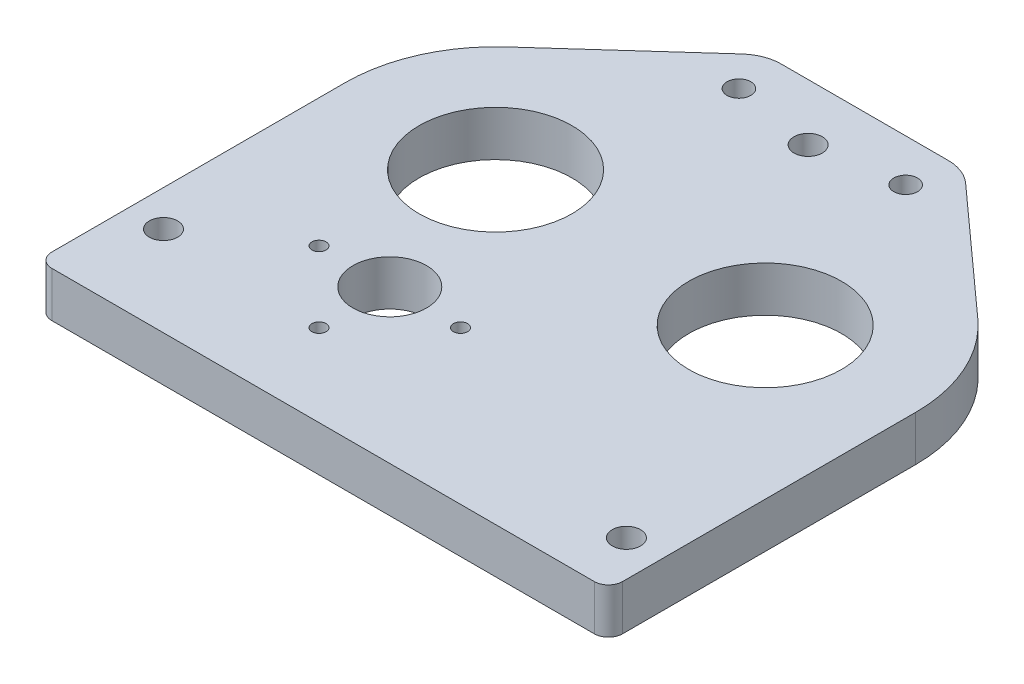
ISO-10303-21;
HEADER;
FILE_DESCRIPTION(('STEP AP214'),'2;1');
FILE_NAME('part.step','',(''),(''),'','','');
FILE_SCHEMA(('AUTOMOTIVE_DESIGN { 1 0 10303 214 1 1 1 1 }'));
ENDSEC;
DATA;
#1=APPLICATION_CONTEXT('core data for automotive mechanical design processes');
#2=APPLICATION_PROTOCOL_DEFINITION('international standard','automotive_design',2000,#1);
#3=PRODUCT_CONTEXT('',#1,'mechanical');
#4=PRODUCT('Part','Part','',(#3));
#5=PRODUCT_RELATED_PRODUCT_CATEGORY('part','',(#4));
#6=PRODUCT_DEFINITION_FORMATION('','',#4);
#7=PRODUCT_DEFINITION_CONTEXT('part definition',#1,'design');
#8=PRODUCT_DEFINITION('design','',#6,#7);
#9=PRODUCT_DEFINITION_SHAPE('','',#8);
#10=(LENGTH_UNIT() NAMED_UNIT(*) SI_UNIT(.MILLI.,.METRE.));
#11=(NAMED_UNIT(*) PLANE_ANGLE_UNIT() SI_UNIT($,.RADIAN.));
#12=(NAMED_UNIT(*) SI_UNIT($,.STERADIAN.) SOLID_ANGLE_UNIT());
#13=UNCERTAINTY_MEASURE_WITH_UNIT(LENGTH_MEASURE(1.E-05),#10,'distance_accuracy_value','');
#14=(GEOMETRIC_REPRESENTATION_CONTEXT(3) GLOBAL_UNCERTAINTY_ASSIGNED_CONTEXT((#13)) GLOBAL_UNIT_ASSIGNED_CONTEXT((#10,
#11,#12)) REPRESENTATION_CONTEXT('',''));
#15=CARTESIAN_POINT('',(0.,0.,0.));
#16=DIRECTION('',(0.,0.,1.));
#17=DIRECTION('',(1.,0.,0.));
#18=AXIS2_PLACEMENT_3D('',#15,#16,#17);
#19=CARTESIAN_POINT('',(-8.5725,8.001,-27.2588126804892));
#20=DIRECTION('',(0.,1.,0.));
#21=DIRECTION('',(0.,0.,1.));
#22=AXIS2_PLACEMENT_3D('',#19,#20,#21);
#23=PLANE('',#22);
#24=CARTESIAN_POINT('',(0.,8.001,12.5));
#25=DIRECTION('',(0.,1.,0.));
#26=DIRECTION('',(0.,0.,1.));
#27=AXIS2_PLACEMENT_3D('',#24,#25,#26);
#28=CIRCLE('',#27,1.25);
#29=CARTESIAN_POINT('',(0.,8.001,13.75));
#30=VERTEX_POINT('',#29);
#31=EDGE_CURVE('E505',#30,#30,#28,.T.);
#32=ORIENTED_EDGE('',*,*,#31,.F.);
#33=EDGE_LOOP('',(#32));
#34=FACE_BOUND('',#33,.T.);
#35=CARTESIAN_POINT('',(15.24,8.001,-58.6612603888293));
#36=DIRECTION('',(0.,1.,0.));
#37=DIRECTION('',(0.,0.,1.));
#38=AXIS2_PLACEMENT_3D('',#35,#36,#37);
#39=CIRCLE('',#38,2.5);
#40=CARTESIAN_POINT('',(15.24,8.001,-56.1612603888293));
#41=VERTEX_POINT('',#40);
#42=EDGE_CURVE('E517',#41,#41,#39,.T.);
#43=ORIENTED_EDGE('',*,*,#42,.F.);
#44=EDGE_LOOP('',(#43));
#45=FACE_BOUND('',#44,.T.);
#46=CARTESIAN_POINT('',(0.,8.001,0.));
#47=DIRECTION('',(0.,1.,0.));
#48=DIRECTION('',(0.,0.,1.));
#49=AXIS2_PLACEMENT_3D('',#46,#47,#48);
#50=CIRCLE('',#49,6.5);
#51=CARTESIAN_POINT('',(0.,8.001,6.5));
#52=VERTEX_POINT('',#51);
#53=EDGE_CURVE('E529',#52,#52,#50,.T.);
#54=ORIENTED_EDGE('',*,*,#53,.F.);
#55=EDGE_LOOP('',(#54));
#56=FACE_BOUND('',#55,.T.);
#57=CARTESIAN_POINT('',(39.0525,8.001,-27.2588126804892));
#58=DIRECTION('',(0.,1.,0.));
#59=DIRECTION('',(0.,0.,1.));
#60=AXIS2_PLACEMENT_3D('',#57,#58,#59);
#61=CIRCLE('',#60,13.5001);
#62=CARTESIAN_POINT('',(39.0525,8.001,-13.7587126804892));
#63=VERTEX_POINT('',#62);
#64=EDGE_CURVE('E541',#63,#63,#61,.T.);
#65=ORIENTED_EDGE('',*,*,#64,.F.);
#66=EDGE_LOOP('',(#65));
#67=FACE_BOUND('',#66,.T.);
#68=CARTESIAN_POINT('',(29.9681685848032,8.001,-61.1619990747981));
#69=DIRECTION('',(0.,1.,0.));
#70=DIRECTION('',(0.,0.,1.));
#71=AXIS2_PLACEMENT_3D('',#68,#69,#70);
#72=CIRCLE('',#71,2.09999999999999);
#73=CARTESIAN_POINT('',(29.9681685848032,8.001,-59.0619990747981));
#74=VERTEX_POINT('',#73);
#75=EDGE_CURVE('E256',#74,#74,#72,.T.);
#76=ORIENTED_EDGE('',*,*,#75,.F.);
#77=EDGE_LOOP('',(#76));
#78=FACE_BOUND('',#77,.T.);
#79=DIRECTION('',(1.,0.,0.));
#80=VECTOR('',#79,1.);
#81=CARTESIAN_POINT('',(-35.1724,8.001,27.025));
#82=LINE('',#81,#80);
#83=CARTESIAN_POINT('',(-32.6724,8.001,27.025));
#84=VERTEX_POINT('',#83);
#85=CARTESIAN_POINT('',(63.1524,8.001,27.025));
#86=VERTEX_POINT('',#85);
#87=EDGE_CURVE('E134',#84,#86,#82,.T.);
#88=ORIENTED_EDGE('',*,*,#87,.T.);
#89=CARTESIAN_POINT('',(63.1524,8.001,24.525));
#90=DIRECTION('',(0.,1.,0.));
#91=DIRECTION('',(0.,0.,1.));
#92=AXIS2_PLACEMENT_3D('',#89,#90,#91);
#93=CIRCLE('',#92,2.5);
#94=CARTESIAN_POINT('',(65.6524,8.001,24.525));
#95=VERTEX_POINT('',#94);
#96=EDGE_CURVE('E46',#86,#95,#93,.T.);
#97=ORIENTED_EDGE('',*,*,#96,.T.);
#98=DIRECTION('',(0.,0.,-1.));
#99=VECTOR('',#98,1.);
#100=CARTESIAN_POINT('',(65.6524,8.001,27.025));
#101=LINE('',#100,#99);
#102=CARTESIAN_POINT('',(65.6524,8.001,-27.2588126804892));
#103=VERTEX_POINT('',#102);
#104=EDGE_CURVE('E170',#95,#103,#101,.T.);
#105=ORIENTED_EDGE('',*,*,#104,.T.);
#106=CARTESIAN_POINT('',(39.0525,8.001,-27.2588126804892));
#107=DIRECTION('',(0.,1.,0.));
#108=DIRECTION('',(0.,0.,1.));
#109=AXIS2_PLACEMENT_3D('',#106,#107,#108);
#110=CIRCLE('',#109,26.5999);
#111=CARTESIAN_POINT('',(56.8618691360976,8.001,-47.0168756165215));
#112=VERTEX_POINT('',#111);
#113=EDGE_CURVE('E178',#103,#112,#110,.T.);
#114=ORIENTED_EDGE('',*,*,#113,.T.);
#115=DIRECTION('',(-0.742787113336227,0.,-0.669527672513716));
#116=VECTOR('',#115,1.);
#117=CARTESIAN_POINT('',(34.9891315579587,8.001,-66.7323537384014));
#118=LINE('',#117,#116);
#119=CARTESIAN_POINT('',(34.9891315579587,8.001,-66.7323537384014));
#120=VERTEX_POINT('',#119);
#121=EDGE_CURVE('E227',#112,#120,#118,.T.);
#122=ORIENTED_EDGE('',*,*,#121,.T.);
#123=CARTESIAN_POINT('',(29.9681685848032,8.001,-61.1619990747981));
#124=DIRECTION('',(0.,1.,0.));
#125=DIRECTION('',(0.,0.,1.));
#126=AXIS2_PLACEMENT_3D('',#123,#124,#125);
#127=CIRCLE('',#126,7.49926131403119);
#128=CARTESIAN_POINT('',(29.9681685848032,8.001,-68.6612603888293));
#129=VERTEX_POINT('',#128);
#130=EDGE_CURVE('E243',#120,#129,#127,.T.);
#131=ORIENTED_EDGE('',*,*,#130,.T.);
#132=DIRECTION('',(-1.,0.,0.));
#133=VECTOR('',#132,1.);
#134=CARTESIAN_POINT('',(0.511831415196788,8.001,-68.6612603888293));
#135=LINE('',#134,#133);
#136=CARTESIAN_POINT('',(0.511831415196788,8.001,-68.6612603888293));
#137=VERTEX_POINT('',#136);
#138=EDGE_CURVE('E240',#129,#137,#135,.T.);
#139=ORIENTED_EDGE('',*,*,#138,.T.);
#140=CARTESIAN_POINT('',(0.511831415196788,8.001,-61.1619990747981));
#141=DIRECTION('',(0.,1.,0.));
#142=DIRECTION('',(0.,0.,1.));
#143=AXIS2_PLACEMENT_3D('',#140,#141,#142);
#144=CIRCLE('',#143,7.49926131403118);
#145=CARTESIAN_POINT('',(-4.50913155795866,8.001,-66.7323537384014));
#146=VERTEX_POINT('',#145);
#147=EDGE_CURVE('E242',#137,#146,#144,.T.);
#148=ORIENTED_EDGE('',*,*,#147,.T.);
#149=DIRECTION('',(-0.742787113336228,0.,0.669527672513716));
#150=VECTOR('',#149,1.);
#151=CARTESIAN_POINT('',(-26.3818691360976,8.001,-47.0168756165215));
#152=LINE('',#151,#150);
#153=CARTESIAN_POINT('',(-26.3818691360976,8.001,-47.0168756165215));
#154=VERTEX_POINT('',#153);
#155=EDGE_CURVE('E140',#146,#154,#152,.T.);
#156=ORIENTED_EDGE('',*,*,#155,.T.);
#157=CARTESIAN_POINT('',(-8.5725,8.001,-27.2588126804892));
#158=DIRECTION('',(0.,1.,0.));
#159=DIRECTION('',(0.,0.,1.));
#160=AXIS2_PLACEMENT_3D('',#157,#158,#159);
#161=CIRCLE('',#160,26.5999);
#162=CARTESIAN_POINT('',(-35.1724,8.001,-27.2588126804892));
#163=VERTEX_POINT('',#162);
#164=EDGE_CURVE('E135',#154,#163,#161,.T.);
#165=ORIENTED_EDGE('',*,*,#164,.T.);
#166=DIRECTION('',(0.,0.,1.));
#167=VECTOR('',#166,1.);
#168=CARTESIAN_POINT('',(-35.1724,8.001,-27.2588126804892));
#169=LINE('',#168,#167);
#170=CARTESIAN_POINT('',(-35.1724,8.001,24.525));
#171=VERTEX_POINT('',#170);
#172=EDGE_CURVE('E126',#163,#171,#169,.T.);
#173=ORIENTED_EDGE('',*,*,#172,.T.);
#174=CARTESIAN_POINT('',(-32.6724,8.001,24.525));
#175=DIRECTION('',(0.,1.,0.));
#176=DIRECTION('',(0.,0.,1.));
#177=AXIS2_PLACEMENT_3D('',#174,#175,#176);
#178=CIRCLE('',#177,2.5);
#179=EDGE_CURVE('E167',#171,#84,#178,.T.);
#180=ORIENTED_EDGE('',*,*,#179,.T.);
#181=EDGE_LOOP('',(#88,#97,#105,#114,#122,#131,#139,#148,#156,#165,#173,#180));
#182=FACE_BOUND('',#181,.T.);
#183=CARTESIAN_POINT('',(0.511831415196788,8.001,-61.1619990747981));
#184=DIRECTION('',(0.,1.,0.));
#185=DIRECTION('',(0.,0.,1.));
#186=AXIS2_PLACEMENT_3D('',#183,#184,#185);
#187=CIRCLE('',#186,2.1);
#188=CARTESIAN_POINT('',(0.511831415196788,8.001,-59.0619990747981));
#189=VERTEX_POINT('',#188);
#190=EDGE_CURVE('E249',#189,#189,#187,.T.);
#191=ORIENTED_EDGE('',*,*,#190,.F.);
#192=EDGE_LOOP('',(#191));
#193=FACE_BOUND('',#192,.T.);
#194=CARTESIAN_POINT('',(-28.8224,8.001,11.15));
#195=DIRECTION('',(0.,1.,0.));
#196=DIRECTION('',(0.,0.,1.));
#197=AXIS2_PLACEMENT_3D('',#194,#195,#196);
#198=CIRCLE('',#197,2.5);
#199=CARTESIAN_POINT('',(-28.8224,8.001,13.65));
#200=VERTEX_POINT('',#199);
#201=EDGE_CURVE('E547',#200,#200,#198,.T.);
#202=ORIENTED_EDGE('',*,*,#201,.F.);
#203=EDGE_LOOP('',(#202));
#204=FACE_BOUND('',#203,.T.);
#205=CARTESIAN_POINT('',(-8.5725,8.001,-27.2588126804892));
#206=DIRECTION('',(0.,1.,0.));
#207=DIRECTION('',(0.,0.,1.));
#208=AXIS2_PLACEMENT_3D('',#205,#206,#207);
#209=CIRCLE('',#208,13.5001);
#210=CARTESIAN_POINT('',(-8.5725,8.001,-13.7587126804892));
#211=VERTEX_POINT('',#210);
#212=EDGE_CURVE('E535',#211,#211,#209,.T.);
#213=ORIENTED_EDGE('',*,*,#212,.F.);
#214=EDGE_LOOP('',(#213));
#215=FACE_BOUND('',#214,.T.);
#216=CARTESIAN_POINT('',(59.3024,8.001,17.5));
#217=DIRECTION('',(0.,1.,0.));
#218=DIRECTION('',(0.,0.,1.));
#219=AXIS2_PLACEMENT_3D('',#216,#217,#218);
#220=CIRCLE('',#219,2.50000000000001);
#221=CARTESIAN_POINT('',(59.3024,8.001,20.));
#222=VERTEX_POINT('',#221);
#223=EDGE_CURVE('E523',#222,#222,#220,.T.);
#224=ORIENTED_EDGE('',*,*,#223,.F.);
#225=EDGE_LOOP('',(#224));
#226=FACE_BOUND('',#225,.T.);
#227=CARTESIAN_POINT('',(12.5,8.001,0.));
#228=DIRECTION('',(0.,1.,0.));
#229=DIRECTION('',(0.,0.,1.));
#230=AXIS2_PLACEMENT_3D('',#227,#228,#229);
#231=CIRCLE('',#230,1.25);
#232=CARTESIAN_POINT('',(12.5,8.001,1.25000000000001));
#233=VERTEX_POINT('',#232);
#234=EDGE_CURVE('E511',#233,#233,#231,.T.);
#235=ORIENTED_EDGE('',*,*,#234,.F.);
#236=EDGE_LOOP('',(#235));
#237=FACE_BOUND('',#236,.T.);
#238=CARTESIAN_POINT('',(-12.5,8.001,0.));
#239=DIRECTION('',(0.,1.,0.));
#240=DIRECTION('',(0.,0.,1.));
#241=AXIS2_PLACEMENT_3D('',#238,#239,#240);
#242=CIRCLE('',#241,1.25);
#243=CARTESIAN_POINT('',(-12.5,8.001,1.24999999999999));
#244=VERTEX_POINT('',#243);
#245=EDGE_CURVE('E496',#244,#244,#242,.T.);
#246=ORIENTED_EDGE('',*,*,#245,.F.);
#247=EDGE_LOOP('',(#246));
#248=FACE_BOUND('',#247,.T.);
#249=ADVANCED_FACE('F38',(#34,#45,#56,#67,#78,#182,#193,#204,#215,#226,#237,#248),#23,.T.);
#250=CARTESIAN_POINT('',(-8.5725,0.,-27.2588126804892));
#251=DIRECTION('',(0.,1.,0.));
#252=DIRECTION('',(0.,0.,1.));
#253=AXIS2_PLACEMENT_3D('',#250,#251,#252);
#254=PLANE('',#253);
#255=DIRECTION('',(0.,0.,-1.));
#256=VECTOR('',#255,1.);
#257=CARTESIAN_POINT('',(65.6524,0.,27.025));
#258=LINE('',#257,#256);
#259=CARTESIAN_POINT('',(65.6524,0.,24.525));
#260=VERTEX_POINT('',#259);
#261=CARTESIAN_POINT('',(65.6524,0.,-27.2588126804892));
#262=VERTEX_POINT('',#261);
#263=EDGE_CURVE('E187',#260,#262,#258,.T.);
#264=ORIENTED_EDGE('',*,*,#263,.F.);
#265=CARTESIAN_POINT('',(63.1524,0.,24.525));
#266=DIRECTION('',(0.,1.,0.));
#267=DIRECTION('',(0.,0.,1.));
#268=AXIS2_PLACEMENT_3D('',#265,#266,#267);
#269=CIRCLE('',#268,2.5);
#270=CARTESIAN_POINT('',(63.1524,0.,27.025));
#271=VERTEX_POINT('',#270);
#272=EDGE_CURVE('E161',#260,#271,#269,.F.);
#273=ORIENTED_EDGE('',*,*,#272,.T.);
#274=DIRECTION('',(1.,0.,0.));
#275=VECTOR('',#274,1.);
#276=CARTESIAN_POINT('',(-35.1724,0.,27.025));
#277=LINE('',#276,#275);
#278=CARTESIAN_POINT('',(-32.6724,0.,27.025));
#279=VERTEX_POINT('',#278);
#280=EDGE_CURVE('E185',#279,#271,#277,.T.);
#281=ORIENTED_EDGE('',*,*,#280,.F.);
#282=CARTESIAN_POINT('',(-32.6724,0.,24.525));
#283=DIRECTION('',(0.,1.,0.));
#284=DIRECTION('',(0.,0.,1.));
#285=AXIS2_PLACEMENT_3D('',#282,#283,#284);
#286=CIRCLE('',#285,2.5);
#287=CARTESIAN_POINT('',(-35.1724,0.,24.525));
#288=VERTEX_POINT('',#287);
#289=EDGE_CURVE('E153',#279,#288,#286,.F.);
#290=ORIENTED_EDGE('',*,*,#289,.T.);
#291=DIRECTION('',(0.,0.,1.));
#292=VECTOR('',#291,1.);
#293=CARTESIAN_POINT('',(-35.1724,0.,-27.2588126804892));
#294=LINE('',#293,#292);
#295=CARTESIAN_POINT('',(-35.1724,0.,-27.2588126804892));
#296=VERTEX_POINT('',#295);
#297=EDGE_CURVE('E190',#296,#288,#294,.T.);
#298=ORIENTED_EDGE('',*,*,#297,.F.);
#299=CARTESIAN_POINT('',(-8.5725,0.,-27.2588126804892));
#300=DIRECTION('',(0.,1.,0.));
#301=DIRECTION('',(0.,0.,1.));
#302=AXIS2_PLACEMENT_3D('',#299,#300,#301);
#303=CIRCLE('',#302,26.5999);
#304=CARTESIAN_POINT('',(-26.3818691360976,0.,-47.0168756165215));
#305=VERTEX_POINT('',#304);
#306=EDGE_CURVE('E148',#305,#296,#303,.T.);
#307=ORIENTED_EDGE('',*,*,#306,.F.);
#308=DIRECTION('',(-0.742787113336228,0.,0.669527672513716));
#309=VECTOR('',#308,1.);
#310=CARTESIAN_POINT('',(-26.3818691360976,0.,-47.0168756165215));
#311=LINE('',#310,#309);
#312=CARTESIAN_POINT('',(-4.50913155795866,0.,-66.7323537384014));
#313=VERTEX_POINT('',#312);
#314=EDGE_CURVE('E144',#313,#305,#311,.T.);
#315=ORIENTED_EDGE('',*,*,#314,.F.);
#316=CARTESIAN_POINT('',(0.511831415196788,0.,-61.1619990747981));
#317=DIRECTION('',(0.,1.,0.));
#318=DIRECTION('',(0.,0.,1.));
#319=AXIS2_PLACEMENT_3D('',#316,#317,#318);
#320=CIRCLE('',#319,7.49926131403118);
#321=CARTESIAN_POINT('',(0.511831415196788,0.,-68.6612603888293));
#322=VERTEX_POINT('',#321);
#323=EDGE_CURVE('E204',#322,#313,#320,.T.);
#324=ORIENTED_EDGE('',*,*,#323,.F.);
#325=DIRECTION('',(-1.,0.,0.));
#326=VECTOR('',#325,1.);
#327=CARTESIAN_POINT('',(0.511831415196788,0.,-68.6612603888293));
#328=LINE('',#327,#326);
#329=CARTESIAN_POINT('',(29.9681685848032,0.,-68.6612603888293));
#330=VERTEX_POINT('',#329);
#331=EDGE_CURVE('E202',#330,#322,#328,.T.);
#332=ORIENTED_EDGE('',*,*,#331,.F.);
#333=CARTESIAN_POINT('',(29.9681685848032,0.,-61.1619990747981));
#334=DIRECTION('',(0.,1.,0.));
#335=DIRECTION('',(0.,0.,1.));
#336=AXIS2_PLACEMENT_3D('',#333,#334,#335);
#337=CIRCLE('',#336,7.49926131403119);
#338=CARTESIAN_POINT('',(34.9891315579587,0.,-66.7323537384014));
#339=VERTEX_POINT('',#338);
#340=EDGE_CURVE('E200',#339,#330,#337,.T.);
#341=ORIENTED_EDGE('',*,*,#340,.F.);
#342=DIRECTION('',(-0.742787113336227,0.,-0.669527672513716));
#343=VECTOR('',#342,1.);
#344=CARTESIAN_POINT('',(34.9891315579587,0.,-66.7323537384014));
#345=LINE('',#344,#343);
#346=CARTESIAN_POINT('',(56.8618691360976,0.,-47.0168756165215));
#347=VERTEX_POINT('',#346);
#348=EDGE_CURVE('E198',#347,#339,#345,.T.);
#349=ORIENTED_EDGE('',*,*,#348,.F.);
#350=CARTESIAN_POINT('',(39.0525,0.,-27.2588126804892));
#351=DIRECTION('',(0.,1.,0.));
#352=DIRECTION('',(0.,0.,1.));
#353=AXIS2_PLACEMENT_3D('',#350,#351,#352);
#354=CIRCLE('',#353,26.5999);
#355=EDGE_CURVE('E192',#262,#347,#354,.T.);
#356=ORIENTED_EDGE('',*,*,#355,.F.);
#357=EDGE_LOOP('',(#264,#273,#281,#290,#298,#307,#315,#324,#332,#341,#349,#356));
#358=FACE_BOUND('',#357,.T.);
#359=CARTESIAN_POINT('',(0.511831415196788,0.,-61.1619990747981));
#360=DIRECTION('',(0.,1.,0.));
#361=DIRECTION('',(0.,0.,1.));
#362=AXIS2_PLACEMENT_3D('',#359,#360,#361);
#363=CIRCLE('',#362,2.1);
#364=CARTESIAN_POINT('',(0.511831415196788,0.,-59.0619990747981));
#365=VERTEX_POINT('',#364);
#366=EDGE_CURVE('E251',#365,#365,#363,.T.);
#367=ORIENTED_EDGE('',*,*,#366,.T.);
#368=EDGE_LOOP('',(#367));
#369=FACE_BOUND('',#368,.T.);
#370=CARTESIAN_POINT('',(29.9681685848032,0.,-61.1619990747981));
#371=DIRECTION('',(0.,1.,0.));
#372=DIRECTION('',(0.,0.,1.));
#373=AXIS2_PLACEMENT_3D('',#370,#371,#372);
#374=CIRCLE('',#373,2.09999999999999);
#375=CARTESIAN_POINT('',(29.9681685848032,0.,-59.0619990747981));
#376=VERTEX_POINT('',#375);
#377=EDGE_CURVE('E259',#376,#376,#374,.T.);
#378=ORIENTED_EDGE('',*,*,#377,.T.);
#379=EDGE_LOOP('',(#378));
#380=FACE_BOUND('',#379,.T.);
#381=CARTESIAN_POINT('',(-28.8224,0.,11.15));
#382=DIRECTION('',(0.,1.,0.));
#383=DIRECTION('',(0.,0.,1.));
#384=AXIS2_PLACEMENT_3D('',#381,#382,#383);
#385=CIRCLE('',#384,2.5);
#386=CARTESIAN_POINT('',(-28.8224,0.,13.65));
#387=VERTEX_POINT('',#386);
#388=EDGE_CURVE('E544',#387,#387,#385,.T.);
#389=ORIENTED_EDGE('',*,*,#388,.T.);
#390=EDGE_LOOP('',(#389));
#391=FACE_BOUND('',#390,.T.);
#392=CARTESIAN_POINT('',(39.0525,0.,-27.2588126804892));
#393=DIRECTION('',(0.,1.,0.));
#394=DIRECTION('',(0.,0.,1.));
#395=AXIS2_PLACEMENT_3D('',#392,#393,#394);
#396=CIRCLE('',#395,13.5001);
#397=CARTESIAN_POINT('',(39.0525,0.,-13.7587126804892));
#398=VERTEX_POINT('',#397);
#399=EDGE_CURVE('E538',#398,#398,#396,.T.);
#400=ORIENTED_EDGE('',*,*,#399,.T.);
#401=EDGE_LOOP('',(#400));
#402=FACE_BOUND('',#401,.T.);
#403=CARTESIAN_POINT('',(-8.5725,0.,-27.2588126804892));
#404=DIRECTION('',(0.,1.,0.));
#405=DIRECTION('',(0.,0.,1.));
#406=AXIS2_PLACEMENT_3D('',#403,#404,#405);
#407=CIRCLE('',#406,13.5001);
#408=CARTESIAN_POINT('',(-8.5725,0.,-13.7587126804892));
#409=VERTEX_POINT('',#408);
#410=EDGE_CURVE('E532',#409,#409,#407,.T.);
#411=ORIENTED_EDGE('',*,*,#410,.T.);
#412=EDGE_LOOP('',(#411));
#413=FACE_BOUND('',#412,.T.);
#414=CARTESIAN_POINT('',(0.,0.,0.));
#415=DIRECTION('',(0.,1.,0.));
#416=DIRECTION('',(0.,0.,1.));
#417=AXIS2_PLACEMENT_3D('',#414,#415,#416);
#418=CIRCLE('',#417,6.5);
#419=CARTESIAN_POINT('',(0.,0.,6.5));
#420=VERTEX_POINT('',#419);
#421=EDGE_CURVE('E526',#420,#420,#418,.T.);
#422=ORIENTED_EDGE('',*,*,#421,.T.);
#423=EDGE_LOOP('',(#422));
#424=FACE_BOUND('',#423,.T.);
#425=CARTESIAN_POINT('',(59.3024,0.,17.5));
#426=DIRECTION('',(0.,1.,0.));
#427=DIRECTION('',(0.,0.,1.));
#428=AXIS2_PLACEMENT_3D('',#425,#426,#427);
#429=CIRCLE('',#428,2.50000000000001);
#430=CARTESIAN_POINT('',(59.3024,0.,20.));
#431=VERTEX_POINT('',#430);
#432=EDGE_CURVE('E520',#431,#431,#429,.T.);
#433=ORIENTED_EDGE('',*,*,#432,.T.);
#434=EDGE_LOOP('',(#433));
#435=FACE_BOUND('',#434,.T.);
#436=CARTESIAN_POINT('',(15.24,0.,-58.6612603888293));
#437=DIRECTION('',(0.,1.,0.));
#438=DIRECTION('',(0.,0.,1.));
#439=AXIS2_PLACEMENT_3D('',#436,#437,#438);
#440=CIRCLE('',#439,2.5);
#441=CARTESIAN_POINT('',(15.24,0.,-56.1612603888293));
#442=VERTEX_POINT('',#441);
#443=EDGE_CURVE('E514',#442,#442,#440,.T.);
#444=ORIENTED_EDGE('',*,*,#443,.T.);
#445=EDGE_LOOP('',(#444));
#446=FACE_BOUND('',#445,.T.);
#447=CARTESIAN_POINT('',(12.5,0.,0.));
#448=DIRECTION('',(0.,1.,0.));
#449=DIRECTION('',(0.,0.,1.));
#450=AXIS2_PLACEMENT_3D('',#447,#448,#449);
#451=CIRCLE('',#450,1.25);
#452=CARTESIAN_POINT('',(12.5,0.,1.25000000000001));
#453=VERTEX_POINT('',#452);
#454=EDGE_CURVE('E508',#453,#453,#451,.T.);
#455=ORIENTED_EDGE('',*,*,#454,.T.);
#456=EDGE_LOOP('',(#455));
#457=FACE_BOUND('',#456,.T.);
#458=CARTESIAN_POINT('',(0.,0.,12.5));
#459=DIRECTION('',(0.,1.,0.));
#460=DIRECTION('',(0.,0.,1.));
#461=AXIS2_PLACEMENT_3D('',#458,#459,#460);
#462=CIRCLE('',#461,1.25);
#463=CARTESIAN_POINT('',(0.,0.,13.75));
#464=VERTEX_POINT('',#463);
#465=EDGE_CURVE('E502',#464,#464,#462,.T.);
#466=ORIENTED_EDGE('',*,*,#465,.T.);
#467=EDGE_LOOP('',(#466));
#468=FACE_BOUND('',#467,.T.);
#469=CARTESIAN_POINT('',(-12.5,0.,0.));
#470=DIRECTION('',(0.,1.,0.));
#471=DIRECTION('',(0.,0.,1.));
#472=AXIS2_PLACEMENT_3D('',#469,#470,#471);
#473=CIRCLE('',#472,1.25);
#474=CARTESIAN_POINT('',(-12.5,0.,1.24999999999999));
#475=VERTEX_POINT('',#474);
#476=EDGE_CURVE('E499',#475,#475,#473,.T.);
#477=ORIENTED_EDGE('',*,*,#476,.T.);
#478=EDGE_LOOP('',(#477));
#479=FACE_BOUND('',#478,.T.);
#480=ADVANCED_FACE('F183',(#358,#369,#380,#391,#402,#413,#424,#435,#446,#457,#468,#479),#254,.F.);
#481=CARTESIAN_POINT('',(-8.5725,8.001,-27.2588126804892));
#482=DIRECTION('',(0.,-1.,0.));
#483=DIRECTION('',(0.,0.,-1.));
#484=AXIS2_PLACEMENT_3D('',#481,#482,#483);
#485=CYLINDRICAL_SURFACE('',#484,26.5999);
#486=ORIENTED_EDGE('',*,*,#306,.T.);
#487=DIRECTION('',(0.,-1.,0.));
#488=VECTOR('',#487,1.);
#489=CARTESIAN_POINT('',(-35.1724,8.001,-27.2588126804892));
#490=LINE('',#489,#488);
#491=EDGE_CURVE('E130',#163,#296,#490,.T.);
#492=ORIENTED_EDGE('',*,*,#491,.F.);
#493=ORIENTED_EDGE('',*,*,#164,.F.);
#494=DIRECTION('',(0.,-1.,0.));
#495=VECTOR('',#494,1.);
#496=CARTESIAN_POINT('',(-26.3818691360976,8.001,-47.0168756165215));
#497=LINE('',#496,#495);
#498=EDGE_CURVE('E207',#154,#305,#497,.T.);
#499=ORIENTED_EDGE('',*,*,#498,.T.);
#500=EDGE_LOOP('',(#486,#492,#493,#499));
#501=FACE_BOUND('',#500,.T.);
#502=ADVANCED_FACE('F146',(#501),#485,.T.);
#503=CARTESIAN_POINT('',(-35.1724,8.001,-27.2588126804892));
#504=DIRECTION('',(1.,0.,0.));
#505=DIRECTION('',(0.,0.,-1.));
#506=AXIS2_PLACEMENT_3D('',#503,#504,#505);
#507=PLANE('',#506);
#508=ORIENTED_EDGE('',*,*,#297,.T.);
#509=DIRECTION('',(0.,-1.,0.));
#510=VECTOR('',#509,1.);
#511=CARTESIAN_POINT('',(-35.1724,8.001,24.525));
#512=LINE('',#511,#510);
#513=EDGE_CURVE('E11',#288,#171,#512,.F.);
#514=ORIENTED_EDGE('',*,*,#513,.T.);
#515=ORIENTED_EDGE('',*,*,#172,.F.);
#516=ORIENTED_EDGE('',*,*,#491,.T.);
#517=EDGE_LOOP('',(#508,#514,#515,#516));
#518=FACE_BOUND('',#517,.T.);
#519=ADVANCED_FACE('F128',(#518),#507,.F.);
#520=CARTESIAN_POINT('',(-35.1724,8.001,27.025));
#521=DIRECTION('',(0.,0.,-1.));
#522=DIRECTION('',(-1.,0.,0.));
#523=AXIS2_PLACEMENT_3D('',#520,#521,#522);
#524=PLANE('',#523);
#525=ORIENTED_EDGE('',*,*,#280,.T.);
#526=DIRECTION('',(0.,-1.,0.));
#527=VECTOR('',#526,1.);
#528=CARTESIAN_POINT('',(63.1524,8.001,27.025));
#529=LINE('',#528,#527);
#530=EDGE_CURVE('E59',#271,#86,#529,.F.);
#531=ORIENTED_EDGE('',*,*,#530,.T.);
#532=ORIENTED_EDGE('',*,*,#87,.F.);
#533=DIRECTION('',(0.,-1.,0.));
#534=VECTOR('',#533,1.);
#535=CARTESIAN_POINT('',(-32.6724,8.001,27.025));
#536=LINE('',#535,#534);
#537=EDGE_CURVE('E163',#84,#279,#536,.T.);
#538=ORIENTED_EDGE('',*,*,#537,.T.);
#539=EDGE_LOOP('',(#525,#531,#532,#538));
#540=FACE_BOUND('',#539,.T.);
#541=ADVANCED_FACE('F188',(#540),#524,.F.);
#542=CARTESIAN_POINT('',(65.6524,8.001,27.025));
#543=DIRECTION('',(-1.,0.,0.));
#544=DIRECTION('',(0.,0.,1.));
#545=AXIS2_PLACEMENT_3D('',#542,#543,#544);
#546=PLANE('',#545);
#547=ORIENTED_EDGE('',*,*,#104,.F.);
#548=DIRECTION('',(0.,-1.,0.));
#549=VECTOR('',#548,1.);
#550=CARTESIAN_POINT('',(65.6524,8.001,24.525));
#551=LINE('',#550,#549);
#552=EDGE_CURVE('E149',#95,#260,#551,.T.);
#553=ORIENTED_EDGE('',*,*,#552,.T.);
#554=ORIENTED_EDGE('',*,*,#263,.T.);
#555=DIRECTION('',(0.,-1.,0.));
#556=VECTOR('',#555,1.);
#557=CARTESIAN_POINT('',(65.6524,8.001,-27.2588126804892));
#558=LINE('',#557,#556);
#559=EDGE_CURVE('E150',#103,#262,#558,.T.);
#560=ORIENTED_EDGE('',*,*,#559,.F.);
#561=EDGE_LOOP('',(#547,#553,#554,#560));
#562=FACE_BOUND('',#561,.T.);
#563=ADVANCED_FACE('F175',(#562),#546,.F.);
#564=CARTESIAN_POINT('',(39.0525,8.001,-27.2588126804892));
#565=DIRECTION('',(0.,-1.,0.));
#566=DIRECTION('',(0.,0.,-1.));
#567=AXIS2_PLACEMENT_3D('',#564,#565,#566);
#568=CYLINDRICAL_SURFACE('',#567,26.5999);
#569=ORIENTED_EDGE('',*,*,#355,.T.);
#570=DIRECTION('',(0.,-1.,0.));
#571=VECTOR('',#570,1.);
#572=CARTESIAN_POINT('',(56.8618691360976,8.001,-47.0168756165215));
#573=LINE('',#572,#571);
#574=EDGE_CURVE('E156',#112,#347,#573,.T.);
#575=ORIENTED_EDGE('',*,*,#574,.F.);
#576=ORIENTED_EDGE('',*,*,#113,.F.);
#577=ORIENTED_EDGE('',*,*,#559,.T.);
#578=EDGE_LOOP('',(#569,#575,#576,#577));
#579=FACE_BOUND('',#578,.T.);
#580=ADVANCED_FACE('F263',(#579),#568,.T.);
#581=CARTESIAN_POINT('',(34.9891315579587,8.001,-66.7323537384014));
#582=DIRECTION('',(-0.669527672513717,0.,0.742787113336227));
#583=DIRECTION('',(0.742787113336227,0.,0.669527672513717));
#584=AXIS2_PLACEMENT_3D('',#581,#582,#583);
#585=PLANE('',#584);
#586=ORIENTED_EDGE('',*,*,#348,.T.);
#587=DIRECTION('',(0.,-1.,0.));
#588=VECTOR('',#587,1.);
#589=CARTESIAN_POINT('',(34.9891315579587,8.001,-66.7323537384014));
#590=LINE('',#589,#588);
#591=EDGE_CURVE('E218',#120,#339,#590,.T.);
#592=ORIENTED_EDGE('',*,*,#591,.F.);
#593=ORIENTED_EDGE('',*,*,#121,.F.);
#594=ORIENTED_EDGE('',*,*,#574,.T.);
#595=EDGE_LOOP('',(#586,#592,#593,#594));
#596=FACE_BOUND('',#595,.T.);
#597=ADVANCED_FACE('F225',(#596),#585,.F.);
#598=CARTESIAN_POINT('',(29.9681685848032,8.001,-61.1619990747981));
#599=DIRECTION('',(0.,-1.,0.));
#600=DIRECTION('',(0.,0.,-1.));
#601=AXIS2_PLACEMENT_3D('',#598,#599,#600);
#602=CYLINDRICAL_SURFACE('',#601,7.49926131403119);
#603=ORIENTED_EDGE('',*,*,#340,.T.);
#604=DIRECTION('',(0.,-1.,0.));
#605=VECTOR('',#604,1.);
#606=CARTESIAN_POINT('',(29.9681685848032,8.001,-68.6612603888293));
#607=LINE('',#606,#605);
#608=EDGE_CURVE('E215',#129,#330,#607,.T.);
#609=ORIENTED_EDGE('',*,*,#608,.F.);
#610=ORIENTED_EDGE('',*,*,#130,.F.);
#611=ORIENTED_EDGE('',*,*,#591,.T.);
#612=EDGE_LOOP('',(#603,#609,#610,#611));
#613=FACE_BOUND('',#612,.T.);
#614=ADVANCED_FACE('F234',(#613),#602,.T.);
#615=CARTESIAN_POINT('',(0.511831415196788,8.001,-68.6612603888293));
#616=DIRECTION('',(0.,0.,1.));
#617=DIRECTION('',(1.,0.,0.));
#618=AXIS2_PLACEMENT_3D('',#615,#616,#617);
#619=PLANE('',#618);
#620=ORIENTED_EDGE('',*,*,#331,.T.);
#621=DIRECTION('',(0.,-1.,0.));
#622=VECTOR('',#621,1.);
#623=CARTESIAN_POINT('',(0.511831415196788,8.001,-68.6612603888293));
#624=LINE('',#623,#622);
#625=EDGE_CURVE('E212',#137,#322,#624,.T.);
#626=ORIENTED_EDGE('',*,*,#625,.F.);
#627=ORIENTED_EDGE('',*,*,#138,.F.);
#628=ORIENTED_EDGE('',*,*,#608,.T.);
#629=EDGE_LOOP('',(#620,#626,#627,#628));
#630=FACE_BOUND('',#629,.T.);
#631=ADVANCED_FACE('F238',(#630),#619,.F.);
#632=CARTESIAN_POINT('',(0.511831415196788,8.001,-61.1619990747981));
#633=DIRECTION('',(0.,-1.,0.));
#634=DIRECTION('',(0.,0.,-1.));
#635=AXIS2_PLACEMENT_3D('',#632,#633,#634);
#636=CYLINDRICAL_SURFACE('',#635,7.49926131403118);
#637=ORIENTED_EDGE('',*,*,#323,.T.);
#638=DIRECTION('',(0.,-1.,0.));
#639=VECTOR('',#638,1.);
#640=CARTESIAN_POINT('',(-4.50913155795866,8.001,-66.7323537384014));
#641=LINE('',#640,#639);
#642=EDGE_CURVE('E209',#146,#313,#641,.T.);
#643=ORIENTED_EDGE('',*,*,#642,.F.);
#644=ORIENTED_EDGE('',*,*,#147,.F.);
#645=ORIENTED_EDGE('',*,*,#625,.T.);
#646=EDGE_LOOP('',(#637,#643,#644,#645));
#647=FACE_BOUND('',#646,.T.);
#648=ADVANCED_FACE('F290',(#647),#636,.T.);
#649=CARTESIAN_POINT('',(-26.3818691360976,8.001,-47.0168756165215));
#650=DIRECTION('',(0.669527672513716,0.,0.742787113336228));
#651=DIRECTION('',(0.742787113336228,0.,-0.669527672513716));
#652=AXIS2_PLACEMENT_3D('',#649,#650,#651);
#653=PLANE('',#652);
#654=ORIENTED_EDGE('',*,*,#314,.T.);
#655=ORIENTED_EDGE('',*,*,#498,.F.);
#656=ORIENTED_EDGE('',*,*,#155,.F.);
#657=ORIENTED_EDGE('',*,*,#642,.T.);
#658=EDGE_LOOP('',(#654,#655,#656,#657));
#659=FACE_BOUND('',#658,.T.);
#660=ADVANCED_FACE('F287',(#659),#653,.F.);
#661=CARTESIAN_POINT('',(0.511831415196788,8.001,-61.1619990747981));
#662=DIRECTION('',(0.,-1.,0.));
#663=DIRECTION('',(0.,0.,-1.));
#664=AXIS2_PLACEMENT_3D('',#661,#662,#663);
#665=CYLINDRICAL_SURFACE('',#664,2.1);
#666=ORIENTED_EDGE('',*,*,#190,.T.);
#667=EDGE_LOOP('',(#666));
#668=FACE_BOUND('',#667,.T.);
#669=ORIENTED_EDGE('',*,*,#366,.F.);
#670=EDGE_LOOP('',(#669));
#671=FACE_BOUND('',#670,.T.);
#672=ADVANCED_FACE('F284',(#668,#671),#665,.F.);
#673=CARTESIAN_POINT('',(29.9681685848032,8.001,-61.1619990747981));
#674=DIRECTION('',(0.,-1.,0.));
#675=DIRECTION('',(0.,0.,-1.));
#676=AXIS2_PLACEMENT_3D('',#673,#674,#675);
#677=CYLINDRICAL_SURFACE('',#676,2.09999999999999);
#678=ORIENTED_EDGE('',*,*,#75,.T.);
#679=EDGE_LOOP('',(#678));
#680=FACE_BOUND('',#679,.T.);
#681=ORIENTED_EDGE('',*,*,#377,.F.);
#682=EDGE_LOOP('',(#681));
#683=FACE_BOUND('',#682,.T.);
#684=ADVANCED_FACE('F324',(#680,#683),#677,.F.);
#685=CARTESIAN_POINT('',(-28.8224,8.001,11.15));
#686=DIRECTION('',(0.,-1.,0.));
#687=DIRECTION('',(0.,0.,-1.));
#688=AXIS2_PLACEMENT_3D('',#685,#686,#687);
#689=CYLINDRICAL_SURFACE('',#688,2.5);
#690=ORIENTED_EDGE('',*,*,#201,.T.);
#691=EDGE_LOOP('',(#690));
#692=FACE_BOUND('',#691,.T.);
#693=ORIENTED_EDGE('',*,*,#388,.F.);
#694=EDGE_LOOP('',(#693));
#695=FACE_BOUND('',#694,.T.);
#696=ADVANCED_FACE('F331',(#692,#695),#689,.F.);
#697=CARTESIAN_POINT('',(39.0525,8.001,-27.2588126804892));
#698=DIRECTION('',(0.,-1.,0.));
#699=DIRECTION('',(0.,0.,-1.));
#700=AXIS2_PLACEMENT_3D('',#697,#698,#699);
#701=CYLINDRICAL_SURFACE('',#700,13.5001);
#702=ORIENTED_EDGE('',*,*,#64,.T.);
#703=EDGE_LOOP('',(#702));
#704=FACE_BOUND('',#703,.T.);
#705=ORIENTED_EDGE('',*,*,#399,.F.);
#706=EDGE_LOOP('',(#705));
#707=FACE_BOUND('',#706,.T.);
#708=ADVANCED_FACE('F339',(#704,#707),#701,.F.);
#709=CARTESIAN_POINT('',(-8.5725,8.001,-27.2588126804892));
#710=DIRECTION('',(0.,-1.,0.));
#711=DIRECTION('',(0.,0.,-1.));
#712=AXIS2_PLACEMENT_3D('',#709,#710,#711);
#713=CYLINDRICAL_SURFACE('',#712,13.5001);
#714=ORIENTED_EDGE('',*,*,#212,.T.);
#715=EDGE_LOOP('',(#714));
#716=FACE_BOUND('',#715,.T.);
#717=ORIENTED_EDGE('',*,*,#410,.F.);
#718=EDGE_LOOP('',(#717));
#719=FACE_BOUND('',#718,.T.);
#720=ADVANCED_FACE('F348',(#716,#719),#713,.F.);
#721=CARTESIAN_POINT('',(0.,8.001,0.));
#722=DIRECTION('',(0.,-1.,0.));
#723=DIRECTION('',(0.,0.,-1.));
#724=AXIS2_PLACEMENT_3D('',#721,#722,#723);
#725=CYLINDRICAL_SURFACE('',#724,6.5);
#726=ORIENTED_EDGE('',*,*,#53,.T.);
#727=EDGE_LOOP('',(#726));
#728=FACE_BOUND('',#727,.T.);
#729=ORIENTED_EDGE('',*,*,#421,.F.);
#730=EDGE_LOOP('',(#729));
#731=FACE_BOUND('',#730,.T.);
#732=ADVANCED_FACE('F357',(#728,#731),#725,.F.);
#733=CARTESIAN_POINT('',(59.3024,8.001,17.5));
#734=DIRECTION('',(0.,-1.,0.));
#735=DIRECTION('',(0.,0.,-1.));
#736=AXIS2_PLACEMENT_3D('',#733,#734,#735);
#737=CYLINDRICAL_SURFACE('',#736,2.50000000000001);
#738=ORIENTED_EDGE('',*,*,#223,.T.);
#739=EDGE_LOOP('',(#738));
#740=FACE_BOUND('',#739,.T.);
#741=ORIENTED_EDGE('',*,*,#432,.F.);
#742=EDGE_LOOP('',(#741));
#743=FACE_BOUND('',#742,.T.);
#744=ADVANCED_FACE('F366',(#740,#743),#737,.F.);
#745=CARTESIAN_POINT('',(15.24,8.001,-58.6612603888293));
#746=DIRECTION('',(0.,-1.,0.));
#747=DIRECTION('',(0.,0.,-1.));
#748=AXIS2_PLACEMENT_3D('',#745,#746,#747);
#749=CYLINDRICAL_SURFACE('',#748,2.5);
#750=ORIENTED_EDGE('',*,*,#42,.T.);
#751=EDGE_LOOP('',(#750));
#752=FACE_BOUND('',#751,.T.);
#753=ORIENTED_EDGE('',*,*,#443,.F.);
#754=EDGE_LOOP('',(#753));
#755=FACE_BOUND('',#754,.T.);
#756=ADVANCED_FACE('F375',(#752,#755),#749,.F.);
#757=CARTESIAN_POINT('',(12.5,8.001,0.));
#758=DIRECTION('',(0.,-1.,0.));
#759=DIRECTION('',(0.,0.,-1.));
#760=AXIS2_PLACEMENT_3D('',#757,#758,#759);
#761=CYLINDRICAL_SURFACE('',#760,1.25);
#762=ORIENTED_EDGE('',*,*,#234,.T.);
#763=EDGE_LOOP('',(#762));
#764=FACE_BOUND('',#763,.T.);
#765=ORIENTED_EDGE('',*,*,#454,.F.);
#766=EDGE_LOOP('',(#765));
#767=FACE_BOUND('',#766,.T.);
#768=ADVANCED_FACE('F384',(#764,#767),#761,.F.);
#769=CARTESIAN_POINT('',(0.,8.001,12.5));
#770=DIRECTION('',(0.,-1.,0.));
#771=DIRECTION('',(0.,0.,-1.));
#772=AXIS2_PLACEMENT_3D('',#769,#770,#771);
#773=CYLINDRICAL_SURFACE('',#772,1.25);
#774=ORIENTED_EDGE('',*,*,#31,.T.);
#775=EDGE_LOOP('',(#774));
#776=FACE_BOUND('',#775,.T.);
#777=ORIENTED_EDGE('',*,*,#465,.F.);
#778=EDGE_LOOP('',(#777));
#779=FACE_BOUND('',#778,.T.);
#780=ADVANCED_FACE('F393',(#776,#779),#773,.F.);
#781=CARTESIAN_POINT('',(-12.5,8.001,0.));
#782=DIRECTION('',(0.,-1.,0.));
#783=DIRECTION('',(0.,0.,-1.));
#784=AXIS2_PLACEMENT_3D('',#781,#782,#783);
#785=CYLINDRICAL_SURFACE('',#784,1.25);
#786=ORIENTED_EDGE('',*,*,#245,.T.);
#787=EDGE_LOOP('',(#786));
#788=FACE_BOUND('',#787,.T.);
#789=ORIENTED_EDGE('',*,*,#476,.F.);
#790=EDGE_LOOP('',(#789));
#791=FACE_BOUND('',#790,.T.);
#792=ADVANCED_FACE('F401',(#788,#791),#785,.F.);
#793=CARTESIAN_POINT('',(63.1524,8.001,24.525));
#794=DIRECTION('',(0.,-1.,0.));
#795=DIRECTION('',(0.,0.,-1.));
#796=AXIS2_PLACEMENT_3D('',#793,#794,#795);
#797=CYLINDRICAL_SURFACE('',#796,2.5);
#798=ORIENTED_EDGE('',*,*,#96,.F.);
#799=ORIENTED_EDGE('',*,*,#530,.F.);
#800=ORIENTED_EDGE('',*,*,#272,.F.);
#801=ORIENTED_EDGE('',*,*,#552,.F.);
#802=EDGE_LOOP('',(#798,#799,#800,#801));
#803=FACE_BOUND('',#802,.T.);
#804=ADVANCED_FACE('F180',(#803),#797,.T.);
#805=CARTESIAN_POINT('',(-32.6724,8.001,24.525));
#806=DIRECTION('',(0.,-1.,0.));
#807=DIRECTION('',(0.,0.,-1.));
#808=AXIS2_PLACEMENT_3D('',#805,#806,#807);
#809=CYLINDRICAL_SURFACE('',#808,2.5);
#810=ORIENTED_EDGE('',*,*,#179,.F.);
#811=ORIENTED_EDGE('',*,*,#513,.F.);
#812=ORIENTED_EDGE('',*,*,#289,.F.);
#813=ORIENTED_EDGE('',*,*,#537,.F.);
#814=EDGE_LOOP('',(#810,#811,#812,#813));
#815=FACE_BOUND('',#814,.T.);
#816=ADVANCED_FACE('F40',(#815),#809,.T.);
#817=CLOSED_SHELL('',(#249,#480,#502,#519,#541,#563,#580,#597,#614,#631,#648,#660,#672,#684,
#696,#708,#720,#732,#744,#756,#768,#780,#792,#804,#816));
#818=MANIFOLD_SOLID_BREP('B2',#817);
#819=ADVANCED_BREP_SHAPE_REPRESENTATION('',(#18,#818),#14);
#820=SHAPE_DEFINITION_REPRESENTATION(#9,#819);
ENDSEC;
END-ISO-10303-21;
